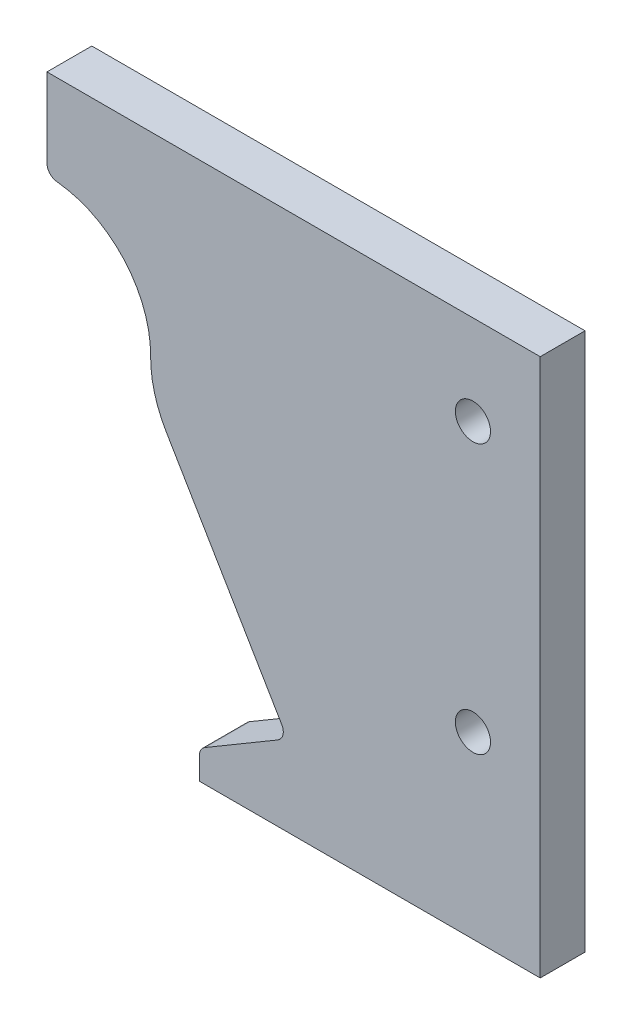
ISO-10303-21;
HEADER;
FILE_DESCRIPTION(('STEP AP214'),'2;1');
FILE_NAME('part.step','',(''),(''),'','','');
FILE_SCHEMA(('AUTOMOTIVE_DESIGN { 1 0 10303 214 1 1 1 1 }'));
ENDSEC;
DATA;
#1=APPLICATION_CONTEXT('core data for automotive mechanical design processes');
#2=APPLICATION_PROTOCOL_DEFINITION('international standard','automotive_design',2000,#1);
#3=PRODUCT_CONTEXT('',#1,'mechanical');
#4=PRODUCT('Part','Part','',(#3));
#5=PRODUCT_RELATED_PRODUCT_CATEGORY('part','',(#4));
#6=PRODUCT_DEFINITION_FORMATION('','',#4);
#7=PRODUCT_DEFINITION_CONTEXT('part definition',#1,'design');
#8=PRODUCT_DEFINITION('design','',#6,#7);
#9=PRODUCT_DEFINITION_SHAPE('','',#8);
#10=(LENGTH_UNIT() NAMED_UNIT(*) SI_UNIT(.MILLI.,.METRE.));
#11=(NAMED_UNIT(*) PLANE_ANGLE_UNIT() SI_UNIT($,.RADIAN.));
#12=(NAMED_UNIT(*) SI_UNIT($,.STERADIAN.) SOLID_ANGLE_UNIT());
#13=UNCERTAINTY_MEASURE_WITH_UNIT(LENGTH_MEASURE(1.E-05),#10,'distance_accuracy_value','');
#14=(GEOMETRIC_REPRESENTATION_CONTEXT(3) GLOBAL_UNCERTAINTY_ASSIGNED_CONTEXT((#13)) GLOBAL_UNIT_ASSIGNED_CONTEXT((#10,
#11,#12)) REPRESENTATION_CONTEXT('',''));
#15=CARTESIAN_POINT('',(0.,0.,0.));
#16=DIRECTION('',(0.,0.,1.));
#17=DIRECTION('',(1.,0.,0.));
#18=AXIS2_PLACEMENT_3D('',#15,#16,#17);
#19=CARTESIAN_POINT('',(30.5552874473024,-0.23615133417149,3.175));
#20=DIRECTION('',(0.,0.,-1.));
#21=DIRECTION('',(-1.,0.,0.));
#22=AXIS2_PLACEMENT_3D('',#19,#20,#21);
#23=PLANE('',#22);
#24=DIRECTION('',(0.,-1.,0.));
#25=VECTOR('',#24,1.);
#26=CARTESIAN_POINT('',(0.,14.6812,3.175));
#27=LINE('',#26,#25);
#28=CARTESIAN_POINT('',(0.,27.3812,3.175));
#29=VERTEX_POINT('',#28);
#30=CARTESIAN_POINT('',(0.,16.1910606026906,3.175));
#31=VERTEX_POINT('',#30);
#32=EDGE_CURVE('E270',#29,#31,#27,.T.);
#33=ORIENTED_EDGE('',*,*,#32,.T.);
#34=CARTESIAN_POINT('',(1.5875,16.1910606026906,3.175));
#35=DIRECTION('',(0.,0.,-1.));
#36=DIRECTION('',(-1.,0.,0.));
#37=AXIS2_PLACEMENT_3D('',#34,#35,#36);
#38=CIRCLE('',#37,1.5875);
#39=CARTESIAN_POINT('',(1.43259172521467,14.6111366562922,3.175));
#40=VERTEX_POINT('',#39);
#41=EDGE_CURVE('E180',#31,#40,#38,.F.);
#42=ORIENTED_EDGE('',*,*,#41,.T.);
#43=CARTESIAN_POINT('',(0.,0.,3.175));
#44=DIRECTION('',(0.,0.,-1.));
#45=DIRECTION('',(1.,0.,0.));
#46=AXIS2_PLACEMENT_3D('',#43,#44,#45);
#47=CIRCLE('',#46,14.6812);
#48=CARTESIAN_POINT('',(14.68076154991,-0.113462569535437,3.175));
#49=VERTEX_POINT('',#48);
#50=EDGE_CURVE('E281',#40,#49,#47,.T.);
#51=ORIENTED_EDGE('',*,*,#50,.T.);
#52=CARTESIAN_POINT('',(30.5552874473024,-0.23615133417149,3.175));
#53=DIRECTION('',(0.,0.,1.));
#54=DIRECTION('',(-1.,0.,0.));
#55=AXIS2_PLACEMENT_3D('',#52,#53,#54);
#56=CIRCLE('',#55,15.8749999999985);
#57=CARTESIAN_POINT('',(16.8839609413004,-8.3052564001772,3.175));
#58=VERTEX_POINT('',#57);
#59=EDGE_CURVE('E229',#49,#58,#56,.T.);
#60=ORIENTED_EDGE('',*,*,#59,.T.);
#61=DIRECTION('',(0.508290082898049,-0.861185921638002,0.));
#62=VECTOR('',#61,1.);
#63=CARTESIAN_POINT('',(34.0550165217625,-37.3978392049525,3.175));
#64=LINE('',#63,#62);
#65=CARTESIAN_POINT('',(33.2481060151619,-36.0307065543522,3.175));
#66=VERTEX_POINT('',#65);
#67=EDGE_CURVE('E221',#58,#66,#64,.T.);
#68=ORIENTED_EDGE('',*,*,#67,.T.);
#69=CARTESIAN_POINT('',(31.8809733645615,-36.8376170609528,3.175));
#70=DIRECTION('',(0.,0.,-1.));
#71=DIRECTION('',(-1.,0.,0.));
#72=AXIS2_PLACEMENT_3D('',#69,#70,#71);
#73=CIRCLE('',#72,1.5875);
#74=CARTESIAN_POINT('',(32.6878838711622,-38.2047497115532,3.175));
#75=VERTEX_POINT('',#74);
#76=EDGE_CURVE('E11',#66,#75,#73,.T.);
#77=ORIENTED_EDGE('',*,*,#76,.T.);
#78=DIRECTION('',(-0.861185921638003,-0.508290082898047,0.));
#79=VECTOR('',#78,1.);
#80=CARTESIAN_POINT('',(21.5766059999893,-44.7628601129627,3.175));
#81=LINE('',#80,#79);
#82=CARTESIAN_POINT('',(22.3571954933887,-44.3021397408105,3.175));
#83=VERTEX_POINT('',#82);
#84=EDGE_CURVE('E220',#75,#83,#81,.T.);
#85=ORIENTED_EDGE('',*,*,#84,.T.);
#86=CARTESIAN_POINT('',(23.1641059999893,-45.6692723914109,3.175));
#87=DIRECTION('',(0.,0.,-1.));
#88=DIRECTION('',(-1.,0.,0.));
#89=AXIS2_PLACEMENT_3D('',#86,#87,#88);
#90=CIRCLE('',#89,1.5875);
#91=CARTESIAN_POINT('',(21.5766059999893,-45.6692723914109,3.175));
#92=VERTEX_POINT('',#91);
#93=EDGE_CURVE('E57',#83,#92,#90,.F.);
#94=ORIENTED_EDGE('',*,*,#93,.T.);
#95=DIRECTION('',(0.,-1.,0.));
#96=VECTOR('',#95,1.);
#97=CARTESIAN_POINT('',(21.5766059999893,-48.8188,3.175));
#98=LINE('',#97,#96);
#99=CARTESIAN_POINT('',(21.5766059999893,-48.8188,3.175));
#100=VERTEX_POINT('',#99);
#101=EDGE_CURVE('E148',#92,#100,#98,.T.);
#102=ORIENTED_EDGE('',*,*,#101,.T.);
#103=DIRECTION('',(1.,0.,0.));
#104=VECTOR('',#103,1.);
#105=CARTESIAN_POINT('',(69.85,-48.8188,3.175));
#106=LINE('',#105,#104);
#107=CARTESIAN_POINT('',(69.85,-48.8188,3.175));
#108=VERTEX_POINT('',#107);
#109=EDGE_CURVE('E143',#100,#108,#106,.T.);
#110=ORIENTED_EDGE('',*,*,#109,.T.);
#111=DIRECTION('',(0.,1.,0.));
#112=VECTOR('',#111,1.);
#113=CARTESIAN_POINT('',(69.85,27.3812,3.175));
#114=LINE('',#113,#112);
#115=CARTESIAN_POINT('',(69.85,27.3812,3.175));
#116=VERTEX_POINT('',#115);
#117=EDGE_CURVE('E132',#108,#116,#114,.T.);
#118=ORIENTED_EDGE('',*,*,#117,.T.);
#119=DIRECTION('',(-1.,0.,0.));
#120=VECTOR('',#119,1.);
#121=CARTESIAN_POINT('',(0.,27.3812,3.175));
#122=LINE('',#121,#120);
#123=EDGE_CURVE('E142',#116,#29,#122,.T.);
#124=ORIENTED_EDGE('',*,*,#123,.T.);
#125=EDGE_LOOP('',(#33,#42,#51,#60,#68,#77,#85,#94,#102,#110,#118,#124));
#126=FACE_BOUND('',#125,.T.);
#127=CARTESIAN_POINT('',(60.325,14.6812,3.175));
#128=DIRECTION('',(0.,0.,1.));
#129=DIRECTION('',(1.,0.,0.));
#130=AXIS2_PLACEMENT_3D('',#127,#128,#129);
#131=CIRCLE('',#130,2.4892);
#132=CARTESIAN_POINT('',(62.8142,14.6812,3.175));
#133=VERTEX_POINT('',#132);
#134=EDGE_CURVE('E236',#133,#133,#131,.T.);
#135=ORIENTED_EDGE('',*,*,#134,.F.);
#136=EDGE_LOOP('',(#135));
#137=FACE_BOUND('',#136,.T.);
#138=CARTESIAN_POINT('',(60.325,-23.4188,3.175));
#139=DIRECTION('',(0.,0.,1.));
#140=DIRECTION('',(1.,0.,0.));
#141=AXIS2_PLACEMENT_3D('',#138,#139,#140);
#142=CIRCLE('',#141,2.4892);
#143=CARTESIAN_POINT('',(62.8142,-23.4188,3.175));
#144=VERTEX_POINT('',#143);
#145=EDGE_CURVE('E295',#144,#144,#142,.T.);
#146=ORIENTED_EDGE('',*,*,#145,.F.);
#147=EDGE_LOOP('',(#146));
#148=FACE_BOUND('',#147,.T.);
#149=ADVANCED_FACE('F41',(#126,#137,#148),#23,.F.);
#150=CARTESIAN_POINT('',(30.5552874473024,-0.23615133417149,-3.175));
#151=DIRECTION('',(0.,0.,-1.));
#152=DIRECTION('',(-1.,0.,0.));
#153=AXIS2_PLACEMENT_3D('',#150,#151,#152);
#154=PLANE('',#153);
#155=CARTESIAN_POINT('',(60.325,14.6812,-3.175));
#156=DIRECTION('',(0.,0.,1.));
#157=DIRECTION('',(1.,0.,0.));
#158=AXIS2_PLACEMENT_3D('',#155,#156,#157);
#159=CIRCLE('',#158,2.4892);
#160=CARTESIAN_POINT('',(62.8142,14.6812,-3.175));
#161=VERTEX_POINT('',#160);
#162=EDGE_CURVE('E291',#161,#161,#159,.T.);
#163=ORIENTED_EDGE('',*,*,#162,.T.);
#164=EDGE_LOOP('',(#163));
#165=FACE_BOUND('',#164,.T.);
#166=CARTESIAN_POINT('',(0.,0.,-3.175));
#167=DIRECTION('',(0.,0.,-1.));
#168=DIRECTION('',(1.,0.,0.));
#169=AXIS2_PLACEMENT_3D('',#166,#167,#168);
#170=CIRCLE('',#169,14.6812);
#171=CARTESIAN_POINT('',(1.43259172521467,14.6111366562922,-3.175));
#172=VERTEX_POINT('',#171);
#173=CARTESIAN_POINT('',(14.68076154991,-0.113462569535437,-3.175));
#174=VERTEX_POINT('',#173);
#175=EDGE_CURVE('E246',#172,#174,#170,.T.);
#176=ORIENTED_EDGE('',*,*,#175,.F.);
#177=CARTESIAN_POINT('',(1.5875,16.1910606026906,-3.175));
#178=DIRECTION('',(0.,0.,-1.));
#179=DIRECTION('',(-1.,0.,0.));
#180=AXIS2_PLACEMENT_3D('',#177,#178,#179);
#181=CIRCLE('',#180,1.5875);
#182=CARTESIAN_POINT('',(0.,16.1910606026906,-3.175));
#183=VERTEX_POINT('',#182);
#184=EDGE_CURVE('E172',#172,#183,#181,.T.);
#185=ORIENTED_EDGE('',*,*,#184,.T.);
#186=DIRECTION('',(0.,-1.,0.));
#187=VECTOR('',#186,1.);
#188=CARTESIAN_POINT('',(0.,14.6812,-3.175));
#189=LINE('',#188,#187);
#190=CARTESIAN_POINT('',(0.,27.3812,-3.175));
#191=VERTEX_POINT('',#190);
#192=EDGE_CURVE('E242',#191,#183,#189,.T.);
#193=ORIENTED_EDGE('',*,*,#192,.F.);
#194=DIRECTION('',(-1.,0.,0.));
#195=VECTOR('',#194,1.);
#196=CARTESIAN_POINT('',(0.,27.3812,-3.175));
#197=LINE('',#196,#195);
#198=CARTESIAN_POINT('',(69.85,27.3812,-3.175));
#199=VERTEX_POINT('',#198);
#200=EDGE_CURVE('E239',#199,#191,#197,.T.);
#201=ORIENTED_EDGE('',*,*,#200,.F.);
#202=DIRECTION('',(0.,1.,0.));
#203=VECTOR('',#202,1.);
#204=CARTESIAN_POINT('',(69.85,27.3812,-3.175));
#205=LINE('',#204,#203);
#206=CARTESIAN_POINT('',(69.85,-48.8188,-3.175));
#207=VERTEX_POINT('',#206);
#208=EDGE_CURVE('E235',#207,#199,#205,.T.);
#209=ORIENTED_EDGE('',*,*,#208,.F.);
#210=DIRECTION('',(1.,0.,0.));
#211=VECTOR('',#210,1.);
#212=CARTESIAN_POINT('',(69.85,-48.8188,-3.175));
#213=LINE('',#212,#211);
#214=CARTESIAN_POINT('',(21.5766059999893,-48.8188,-3.175));
#215=VERTEX_POINT('',#214);
#216=EDGE_CURVE('E157',#215,#207,#213,.T.);
#217=ORIENTED_EDGE('',*,*,#216,.F.);
#218=DIRECTION('',(0.,-1.,0.));
#219=VECTOR('',#218,1.);
#220=CARTESIAN_POINT('',(21.5766059999893,-48.8188,-3.175));
#221=LINE('',#220,#219);
#222=CARTESIAN_POINT('',(21.5766059999893,-45.6692723914109,-3.175));
#223=VERTEX_POINT('',#222);
#224=EDGE_CURVE('E153',#223,#215,#221,.T.);
#225=ORIENTED_EDGE('',*,*,#224,.F.);
#226=CARTESIAN_POINT('',(23.1641059999893,-45.6692723914109,-3.175));
#227=DIRECTION('',(0.,0.,-1.));
#228=DIRECTION('',(-1.,0.,0.));
#229=AXIS2_PLACEMENT_3D('',#226,#227,#228);
#230=CIRCLE('',#229,1.5875);
#231=CARTESIAN_POINT('',(22.3571954933887,-44.3021397408105,-3.175));
#232=VERTEX_POINT('',#231);
#233=EDGE_CURVE('E164',#223,#232,#230,.T.);
#234=ORIENTED_EDGE('',*,*,#233,.T.);
#235=DIRECTION('',(-0.861185921638003,-0.508290082898047,0.));
#236=VECTOR('',#235,1.);
#237=CARTESIAN_POINT('',(21.5766059999893,-44.7628601129627,-3.175));
#238=LINE('',#237,#236);
#239=CARTESIAN_POINT('',(32.6878838711622,-38.2047497115532,-3.175));
#240=VERTEX_POINT('',#239);
#241=EDGE_CURVE('E205',#240,#232,#238,.T.);
#242=ORIENTED_EDGE('',*,*,#241,.F.);
#243=CARTESIAN_POINT('',(31.8809733645615,-36.8376170609528,-3.175));
#244=DIRECTION('',(0.,0.,-1.));
#245=DIRECTION('',(-1.,0.,0.));
#246=AXIS2_PLACEMENT_3D('',#243,#244,#245);
#247=CIRCLE('',#246,1.5875);
#248=CARTESIAN_POINT('',(33.2481060151619,-36.0307065543522,-3.175));
#249=VERTEX_POINT('',#248);
#250=EDGE_CURVE('E50',#240,#249,#247,.F.);
#251=ORIENTED_EDGE('',*,*,#250,.T.);
#252=DIRECTION('',(0.508290082898049,-0.861185921638002,0.));
#253=VECTOR('',#252,1.);
#254=CARTESIAN_POINT('',(34.0550165217625,-37.3978392049525,-3.175));
#255=LINE('',#254,#253);
#256=CARTESIAN_POINT('',(16.8839609413004,-8.3052564001772,-3.175));
#257=VERTEX_POINT('',#256);
#258=EDGE_CURVE('E204',#257,#249,#255,.T.);
#259=ORIENTED_EDGE('',*,*,#258,.F.);
#260=CARTESIAN_POINT('',(30.5552874473024,-0.23615133417149,-3.175));
#261=DIRECTION('',(0.,0.,1.));
#262=DIRECTION('',(-1.,0.,0.));
#263=AXIS2_PLACEMENT_3D('',#260,#261,#262);
#264=CIRCLE('',#263,15.8749999999985);
#265=EDGE_CURVE('E217',#174,#257,#264,.T.);
#266=ORIENTED_EDGE('',*,*,#265,.F.);
#267=EDGE_LOOP('',(#176,#185,#193,#201,#209,#217,#225,#234,#242,#251,#259,#266));
#268=FACE_BOUND('',#267,.T.);
#269=CARTESIAN_POINT('',(60.325,-23.4188,-3.175));
#270=DIRECTION('',(0.,0.,1.));
#271=DIRECTION('',(1.,0.,0.));
#272=AXIS2_PLACEMENT_3D('',#269,#270,#271);
#273=CIRCLE('',#272,2.4892);
#274=CARTESIAN_POINT('',(62.8142,-23.4188,-3.175));
#275=VERTEX_POINT('',#274);
#276=EDGE_CURVE('E299',#275,#275,#273,.T.);
#277=ORIENTED_EDGE('',*,*,#276,.T.);
#278=EDGE_LOOP('',(#277));
#279=FACE_BOUND('',#278,.T.);
#280=ADVANCED_FACE('F201',(#165,#268,#279),#154,.T.);
#281=CARTESIAN_POINT('',(69.85,-48.8188,3.175));
#282=DIRECTION('',(0.,1.,0.));
#283=DIRECTION('',(0.,0.,1.));
#284=AXIS2_PLACEMENT_3D('',#281,#282,#283);
#285=PLANE('',#284);
#286=ORIENTED_EDGE('',*,*,#216,.T.);
#287=DIRECTION('',(0.,0.,-1.));
#288=VECTOR('',#287,1.);
#289=CARTESIAN_POINT('',(69.85,-48.8188,3.175));
#290=LINE('',#289,#288);
#291=EDGE_CURVE('E136',#108,#207,#290,.T.);
#292=ORIENTED_EDGE('',*,*,#291,.F.);
#293=ORIENTED_EDGE('',*,*,#109,.F.);
#294=DIRECTION('',(0.,0.,-1.));
#295=VECTOR('',#294,1.);
#296=CARTESIAN_POINT('',(21.5766059999893,-48.8188,3.175));
#297=LINE('',#296,#295);
#298=EDGE_CURVE('E227',#100,#215,#297,.T.);
#299=ORIENTED_EDGE('',*,*,#298,.T.);
#300=EDGE_LOOP('',(#286,#292,#293,#299));
#301=FACE_BOUND('',#300,.T.);
#302=ADVANCED_FACE('F155',(#301),#285,.F.);
#303=CARTESIAN_POINT('',(69.85,27.3812,3.175));
#304=DIRECTION('',(-1.,0.,0.));
#305=DIRECTION('',(0.,-1.,0.));
#306=AXIS2_PLACEMENT_3D('',#303,#304,#305);
#307=PLANE('',#306);
#308=ORIENTED_EDGE('',*,*,#208,.T.);
#309=DIRECTION('',(0.,0.,-1.));
#310=VECTOR('',#309,1.);
#311=CARTESIAN_POINT('',(69.85,27.3812,3.175));
#312=LINE('',#311,#310);
#313=EDGE_CURVE('E139',#116,#199,#312,.T.);
#314=ORIENTED_EDGE('',*,*,#313,.F.);
#315=ORIENTED_EDGE('',*,*,#117,.F.);
#316=ORIENTED_EDGE('',*,*,#291,.T.);
#317=EDGE_LOOP('',(#308,#314,#315,#316));
#318=FACE_BOUND('',#317,.T.);
#319=ADVANCED_FACE('F134',(#318),#307,.F.);
#320=CARTESIAN_POINT('',(0.,27.3812,3.175));
#321=DIRECTION('',(0.,-1.,0.));
#322=DIRECTION('',(1.,0.,0.));
#323=AXIS2_PLACEMENT_3D('',#320,#321,#322);
#324=PLANE('',#323);
#325=ORIENTED_EDGE('',*,*,#200,.T.);
#326=DIRECTION('',(0.,0.,-1.));
#327=VECTOR('',#326,1.);
#328=CARTESIAN_POINT('',(0.,27.3812,3.175));
#329=LINE('',#328,#327);
#330=EDGE_CURVE('E166',#29,#191,#329,.T.);
#331=ORIENTED_EDGE('',*,*,#330,.F.);
#332=ORIENTED_EDGE('',*,*,#123,.F.);
#333=ORIENTED_EDGE('',*,*,#313,.T.);
#334=EDGE_LOOP('',(#325,#331,#332,#333));
#335=FACE_BOUND('',#334,.T.);
#336=ADVANCED_FACE('F337',(#335),#324,.F.);
#337=CARTESIAN_POINT('',(0.,14.6812,3.175));
#338=DIRECTION('',(1.,0.,0.));
#339=DIRECTION('',(0.,1.,0.));
#340=AXIS2_PLACEMENT_3D('',#337,#338,#339);
#341=PLANE('',#340);
#342=ORIENTED_EDGE('',*,*,#192,.T.);
#343=DIRECTION('',(0.,0.,-1.));
#344=VECTOR('',#343,1.);
#345=CARTESIAN_POINT('',(0.,16.1910606026906,3.175));
#346=LINE('',#345,#344);
#347=EDGE_CURVE('E175',#183,#31,#346,.F.);
#348=ORIENTED_EDGE('',*,*,#347,.T.);
#349=ORIENTED_EDGE('',*,*,#32,.F.);
#350=ORIENTED_EDGE('',*,*,#330,.T.);
#351=EDGE_LOOP('',(#342,#348,#349,#350));
#352=FACE_BOUND('',#351,.T.);
#353=ADVANCED_FACE('F268',(#352),#341,.F.);
#354=CARTESIAN_POINT('',(0.,0.,3.175));
#355=DIRECTION('',(0.,0.,-1.));
#356=DIRECTION('',(-1.,0.,0.));
#357=AXIS2_PLACEMENT_3D('',#354,#355,#356);
#358=CYLINDRICAL_SURFACE('',#357,14.6812);
#359=ORIENTED_EDGE('',*,*,#50,.F.);
#360=DIRECTION('',(0.,0.,-1.));
#361=VECTOR('',#360,1.);
#362=CARTESIAN_POINT('',(1.43259172521467,14.6111366562922,3.175));
#363=LINE('',#362,#361);
#364=EDGE_CURVE('E159',#40,#172,#363,.T.);
#365=ORIENTED_EDGE('',*,*,#364,.T.);
#366=ORIENTED_EDGE('',*,*,#175,.T.);
#367=DIRECTION('',(0.,0.,-1.));
#368=VECTOR('',#367,1.);
#369=CARTESIAN_POINT('',(14.68076154991,-0.113462569535437,3.175));
#370=LINE('',#369,#368);
#371=EDGE_CURVE('E259',#49,#174,#370,.T.);
#372=ORIENTED_EDGE('',*,*,#371,.F.);
#373=EDGE_LOOP('',(#359,#365,#366,#372));
#374=FACE_BOUND('',#373,.T.);
#375=ADVANCED_FACE('F279',(#374),#358,.F.);
#376=CARTESIAN_POINT('',(30.5552874473024,-0.23615133417149,3.175));
#377=DIRECTION('',(0.,0.,-1.));
#378=DIRECTION('',(-1.,0.,0.));
#379=AXIS2_PLACEMENT_3D('',#376,#377,#378);
#380=CYLINDRICAL_SURFACE('',#379,15.8749999999985);
#381=ORIENTED_EDGE('',*,*,#265,.T.);
#382=DIRECTION('',(0.,0.,-1.));
#383=VECTOR('',#382,1.);
#384=CARTESIAN_POINT('',(16.8839609413004,-8.3052564001772,3.175));
#385=LINE('',#384,#383);
#386=EDGE_CURVE('E215',#58,#257,#385,.T.);
#387=ORIENTED_EDGE('',*,*,#386,.F.);
#388=ORIENTED_EDGE('',*,*,#59,.F.);
#389=ORIENTED_EDGE('',*,*,#371,.T.);
#390=EDGE_LOOP('',(#381,#387,#388,#389));
#391=FACE_BOUND('',#390,.T.);
#392=ADVANCED_FACE('F329',(#391),#380,.T.);
#393=CARTESIAN_POINT('',(34.0550165217625,-37.3978392049525,3.175));
#394=DIRECTION('',(0.861185921638002,0.508290082898049,0.));
#395=DIRECTION('',(-0.508290082898049,0.861185921638002,0.));
#396=AXIS2_PLACEMENT_3D('',#393,#394,#395);
#397=PLANE('',#396);
#398=ORIENTED_EDGE('',*,*,#258,.T.);
#399=DIRECTION('',(0.,0.,-1.));
#400=VECTOR('',#399,1.);
#401=CARTESIAN_POINT('',(33.2481060151619,-36.0307065543522,3.175));
#402=LINE('',#401,#400);
#403=EDGE_CURVE('E193',#249,#66,#402,.F.);
#404=ORIENTED_EDGE('',*,*,#403,.T.);
#405=ORIENTED_EDGE('',*,*,#67,.F.);
#406=ORIENTED_EDGE('',*,*,#386,.T.);
#407=EDGE_LOOP('',(#398,#404,#405,#406));
#408=FACE_BOUND('',#407,.T.);
#409=ADVANCED_FACE('F211',(#408),#397,.F.);
#410=CARTESIAN_POINT('',(21.5766059999893,-44.7628601129627,3.175));
#411=DIRECTION('',(0.508290082898047,-0.861185921638003,0.));
#412=DIRECTION('',(0.861185921638003,0.508290082898047,0.));
#413=AXIS2_PLACEMENT_3D('',#410,#411,#412);
#414=PLANE('',#413);
#415=ORIENTED_EDGE('',*,*,#241,.T.);
#416=DIRECTION('',(0.,0.,-1.));
#417=VECTOR('',#416,1.);
#418=CARTESIAN_POINT('',(22.3571954933887,-44.3021397408105,3.175));
#419=LINE('',#418,#417);
#420=EDGE_CURVE('E65',#232,#83,#419,.F.);
#421=ORIENTED_EDGE('',*,*,#420,.T.);
#422=ORIENTED_EDGE('',*,*,#84,.F.);
#423=DIRECTION('',(0.,0.,-1.));
#424=VECTOR('',#423,1.);
#425=CARTESIAN_POINT('',(32.6878838711622,-38.2047497115532,-3.175));
#426=LINE('',#425,#424);
#427=EDGE_CURVE('E187',#75,#240,#426,.T.);
#428=ORIENTED_EDGE('',*,*,#427,.T.);
#429=EDGE_LOOP('',(#415,#421,#422,#428));
#430=FACE_BOUND('',#429,.T.);
#431=ADVANCED_FACE('F222',(#430),#414,.F.);
#432=CARTESIAN_POINT('',(21.5766059999893,-48.8188,3.175));
#433=DIRECTION('',(1.,0.,0.));
#434=DIRECTION('',(0.,1.,0.));
#435=AXIS2_PLACEMENT_3D('',#432,#433,#434);
#436=PLANE('',#435);
#437=ORIENTED_EDGE('',*,*,#101,.F.);
#438=DIRECTION('',(0.,0.,-1.));
#439=VECTOR('',#438,1.);
#440=CARTESIAN_POINT('',(21.5766059999893,-45.6692723914109,3.175));
#441=LINE('',#440,#439);
#442=EDGE_CURVE('E183',#92,#223,#441,.T.);
#443=ORIENTED_EDGE('',*,*,#442,.T.);
#444=ORIENTED_EDGE('',*,*,#224,.T.);
#445=ORIENTED_EDGE('',*,*,#298,.F.);
#446=EDGE_LOOP('',(#437,#443,#444,#445));
#447=FACE_BOUND('',#446,.T.);
#448=ADVANCED_FACE('F321',(#447),#436,.F.);
#449=CARTESIAN_POINT('',(60.325,14.6812,3.175));
#450=DIRECTION('',(0.,0.,-1.));
#451=DIRECTION('',(-1.,0.,0.));
#452=AXIS2_PLACEMENT_3D('',#449,#450,#451);
#453=CYLINDRICAL_SURFACE('',#452,2.4892);
#454=ORIENTED_EDGE('',*,*,#134,.T.);
#455=EDGE_LOOP('',(#454));
#456=FACE_BOUND('',#455,.T.);
#457=ORIENTED_EDGE('',*,*,#162,.F.);
#458=EDGE_LOOP('',(#457));
#459=FACE_BOUND('',#458,.T.);
#460=ADVANCED_FACE('F318',(#456,#459),#453,.F.);
#461=CARTESIAN_POINT('',(60.325,-23.4188,3.175));
#462=DIRECTION('',(0.,0.,-1.));
#463=DIRECTION('',(-1.,0.,0.));
#464=AXIS2_PLACEMENT_3D('',#461,#462,#463);
#465=CYLINDRICAL_SURFACE('',#464,2.4892);
#466=ORIENTED_EDGE('',*,*,#145,.T.);
#467=EDGE_LOOP('',(#466));
#468=FACE_BOUND('',#467,.T.);
#469=ORIENTED_EDGE('',*,*,#276,.F.);
#470=EDGE_LOOP('',(#469));
#471=FACE_BOUND('',#470,.T.);
#472=ADVANCED_FACE('F307',(#468,#471),#465,.F.);
#473=CARTESIAN_POINT('',(1.5875,16.1910606026906,3.175));
#474=DIRECTION('',(0.,0.,-1.));
#475=DIRECTION('',(-1.,0.,0.));
#476=AXIS2_PLACEMENT_3D('',#473,#474,#475);
#477=CYLINDRICAL_SURFACE('',#476,1.5875);
#478=ORIENTED_EDGE('',*,*,#41,.F.);
#479=ORIENTED_EDGE('',*,*,#347,.F.);
#480=ORIENTED_EDGE('',*,*,#184,.F.);
#481=ORIENTED_EDGE('',*,*,#364,.F.);
#482=EDGE_LOOP('',(#478,#479,#480,#481));
#483=FACE_BOUND('',#482,.T.);
#484=ADVANCED_FACE('F276',(#483),#477,.T.);
#485=CARTESIAN_POINT('',(23.1641059999893,-45.6692723914109,3.175));
#486=DIRECTION('',(0.,0.,-1.));
#487=DIRECTION('',(-1.,0.,0.));
#488=AXIS2_PLACEMENT_3D('',#485,#486,#487);
#489=CYLINDRICAL_SURFACE('',#488,1.5875);
#490=ORIENTED_EDGE('',*,*,#93,.F.);
#491=ORIENTED_EDGE('',*,*,#420,.F.);
#492=ORIENTED_EDGE('',*,*,#233,.F.);
#493=ORIENTED_EDGE('',*,*,#442,.F.);
#494=EDGE_LOOP('',(#490,#491,#492,#493));
#495=FACE_BOUND('',#494,.T.);
#496=ADVANCED_FACE('F345',(#495),#489,.T.);
#497=CARTESIAN_POINT('',(31.8809733645615,-36.8376170609528,3.175));
#498=DIRECTION('',(0.,0.,1.));
#499=DIRECTION('',(1.,0.,0.));
#500=AXIS2_PLACEMENT_3D('',#497,#498,#499);
#501=CYLINDRICAL_SURFACE('',#500,1.5875);
#502=ORIENTED_EDGE('',*,*,#76,.F.);
#503=ORIENTED_EDGE('',*,*,#403,.F.);
#504=ORIENTED_EDGE('',*,*,#250,.F.);
#505=ORIENTED_EDGE('',*,*,#427,.F.);
#506=EDGE_LOOP('',(#502,#503,#504,#505));
#507=FACE_BOUND('',#506,.T.);
#508=ADVANCED_FACE('F43',(#507),#501,.F.);
#509=CLOSED_SHELL('',(#149,#280,#302,#319,#336,#353,#375,#392,#409,#431,#448,#460,#472,#484,
#496,#508));
#510=MANIFOLD_SOLID_BREP('B2',#509);
#511=ADVANCED_BREP_SHAPE_REPRESENTATION('',(#18,#510),#14);
#512=SHAPE_DEFINITION_REPRESENTATION(#9,#511);
ENDSEC;
END-ISO-10303-21;
